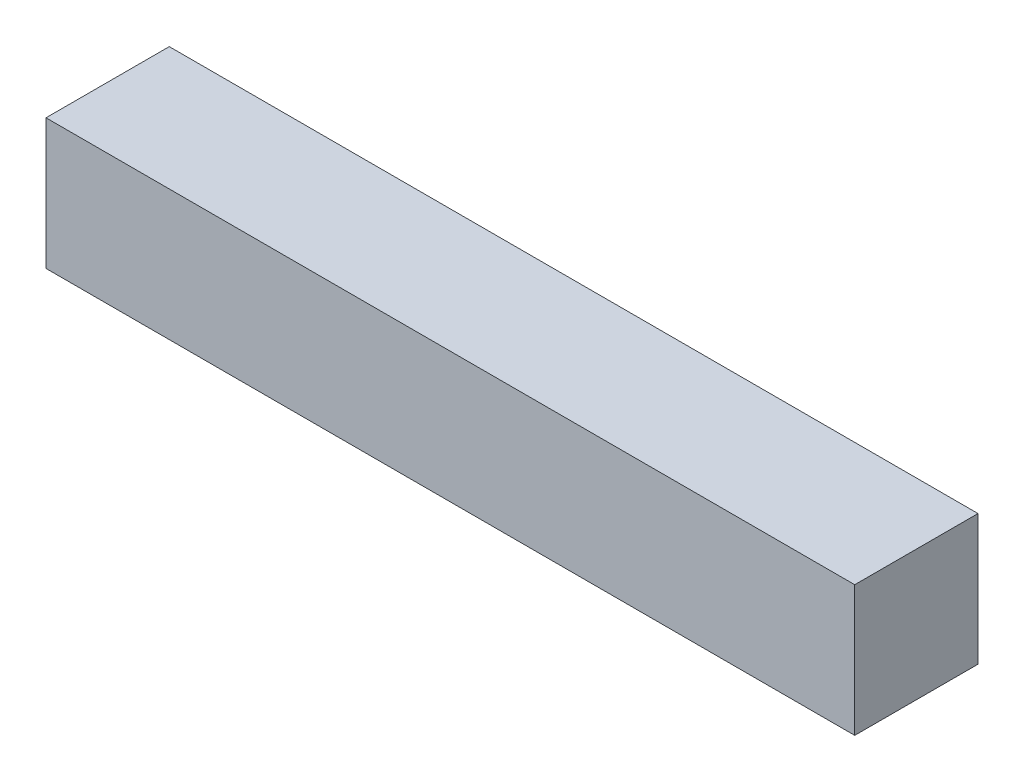
ISO-10303-21;
HEADER;
FILE_DESCRIPTION(('STEP AP214'),'2;1');
FILE_NAME('part.step','',(''),(''),'','','');
FILE_SCHEMA(('AUTOMOTIVE_DESIGN { 1 0 10303 214 1 1 1 1 }'));
ENDSEC;
DATA;
#1=APPLICATION_CONTEXT('core data for automotive mechanical design processes');
#2=APPLICATION_PROTOCOL_DEFINITION('international standard','automotive_design',2000,#1);
#3=PRODUCT_CONTEXT('',#1,'mechanical');
#4=PRODUCT('Part','Part','',(#3));
#5=PRODUCT_RELATED_PRODUCT_CATEGORY('part','',(#4));
#6=PRODUCT_DEFINITION_FORMATION('','',#4);
#7=PRODUCT_DEFINITION_CONTEXT('part definition',#1,'design');
#8=PRODUCT_DEFINITION('design','',#6,#7);
#9=PRODUCT_DEFINITION_SHAPE('','',#8);
#10=(LENGTH_UNIT() NAMED_UNIT(*) SI_UNIT(.MILLI.,.METRE.));
#11=(NAMED_UNIT(*) PLANE_ANGLE_UNIT() SI_UNIT($,.RADIAN.));
#12=(NAMED_UNIT(*) SI_UNIT($,.STERADIAN.) SOLID_ANGLE_UNIT());
#13=UNCERTAINTY_MEASURE_WITH_UNIT(LENGTH_MEASURE(1.E-05),#10,'distance_accuracy_value','');
#14=(GEOMETRIC_REPRESENTATION_CONTEXT(3) GLOBAL_UNCERTAINTY_ASSIGNED_CONTEXT((#13)) GLOBAL_UNIT_ASSIGNED_CONTEXT((#10,
#11,#12)) REPRESENTATION_CONTEXT('',''));
#15=CARTESIAN_POINT('',(0.,0.,0.));
#16=DIRECTION('',(0.,0.,1.));
#17=DIRECTION('',(1.,0.,0.));
#18=AXIS2_PLACEMENT_3D('',#15,#16,#17);
#19=CARTESIAN_POINT('',(500.,40.0630097879282,36.1498785993399));
#20=DIRECTION('',(0.,0.,-1.));
#21=DIRECTION('',(-1.,0.,0.));
#22=AXIS2_PLACEMENT_3D('',#19,#20,#21);
#23=PLANE('',#22);
#24=DIRECTION('',(0.,-1.,0.));
#25=VECTOR('',#24,1.);
#26=CARTESIAN_POINT('',(0.,40.0630097879282,36.1498785993399));
#27=LINE('',#26,#25);
#28=CARTESIAN_POINT('',(0.,40.0630097879282,36.1498785993399));
#29=VERTEX_POINT('',#28);
#30=CARTESIAN_POINT('',(0.,-40.6220285291551,36.1498785993399));
#31=VERTEX_POINT('',#30);
#32=EDGE_CURVE('E113',#29,#31,#27,.T.);
#33=ORIENTED_EDGE('',*,*,#32,.T.);
#34=DIRECTION('',(-1.,0.,0.));
#35=VECTOR('',#34,1.);
#36=CARTESIAN_POINT('',(500.,-40.6220285291551,36.1498785993399));
#37=LINE('',#36,#35);
#38=CARTESIAN_POINT('',(500.,-40.6220285291551,36.1498785993399));
#39=VERTEX_POINT('',#38);
#40=EDGE_CURVE('E11',#39,#31,#37,.T.);
#41=ORIENTED_EDGE('',*,*,#40,.F.);
#42=DIRECTION('',(0.,-1.,0.));
#43=VECTOR('',#42,1.);
#44=CARTESIAN_POINT('',(500.,40.0630097879282,36.1498785993399));
#45=LINE('',#44,#43);
#46=CARTESIAN_POINT('',(500.,40.0630097879282,36.1498785993399));
#47=VERTEX_POINT('',#46);
#48=EDGE_CURVE('E97',#47,#39,#45,.T.);
#49=ORIENTED_EDGE('',*,*,#48,.F.);
#50=DIRECTION('',(-1.,0.,0.));
#51=VECTOR('',#50,1.);
#52=CARTESIAN_POINT('',(500.,40.0630097879282,36.1498785993399));
#53=LINE('',#52,#51);
#54=EDGE_CURVE('E109',#47,#29,#53,.T.);
#55=ORIENTED_EDGE('',*,*,#54,.T.);
#56=EDGE_LOOP('',(#33,#41,#49,#55));
#57=FACE_BOUND('',#56,.T.);
#58=ADVANCED_FACE('F45',(#57),#23,.F.);
#59=CARTESIAN_POINT('',(500.,-40.6220285291551,36.1498785993399));
#60=DIRECTION('',(0.,1.,0.));
#61=DIRECTION('',(0.,0.,1.));
#62=AXIS2_PLACEMENT_3D('',#59,#60,#61);
#63=PLANE('',#62);
#64=DIRECTION('',(0.,0.,-1.));
#65=VECTOR('',#64,1.);
#66=CARTESIAN_POINT('',(0.,-40.6220285291551,36.1498785993399));
#67=LINE('',#66,#65);
#68=CARTESIAN_POINT('',(0.,-40.6220285291551,-40.0630097879282));
#69=VERTEX_POINT('',#68);
#70=EDGE_CURVE('E102',#31,#69,#67,.T.);
#71=ORIENTED_EDGE('',*,*,#70,.T.);
#72=DIRECTION('',(-1.,0.,0.));
#73=VECTOR('',#72,1.);
#74=CARTESIAN_POINT('',(500.,-40.6220285291551,-40.0630097879282));
#75=LINE('',#74,#73);
#76=CARTESIAN_POINT('',(500.,-40.6220285291551,-40.0630097879282));
#77=VERTEX_POINT('',#76);
#78=EDGE_CURVE('E54',#77,#69,#75,.T.);
#79=ORIENTED_EDGE('',*,*,#78,.F.);
#80=DIRECTION('',(0.,0.,-1.));
#81=VECTOR('',#80,1.);
#82=CARTESIAN_POINT('',(500.,-40.6220285291551,36.1498785993399));
#83=LINE('',#82,#81);
#84=EDGE_CURVE('E92',#39,#77,#83,.T.);
#85=ORIENTED_EDGE('',*,*,#84,.F.);
#86=ORIENTED_EDGE('',*,*,#40,.T.);
#87=EDGE_LOOP('',(#71,#79,#85,#86));
#88=FACE_BOUND('',#87,.T.);
#89=ADVANCED_FACE('F101',(#88),#63,.F.);
#90=CARTESIAN_POINT('',(500.,40.0630097879282,-40.0630097879282));
#91=DIRECTION('',(0.,0.,1.));
#92=DIRECTION('',(1.,0.,0.));
#93=AXIS2_PLACEMENT_3D('',#90,#91,#92);
#94=PLANE('',#93);
#95=DIRECTION('',(0.,1.,0.));
#96=VECTOR('',#95,1.);
#97=CARTESIAN_POINT('',(0.,40.0630097879282,-40.0630097879282));
#98=LINE('',#97,#96);
#99=CARTESIAN_POINT('',(0.,40.0630097879282,-40.0630097879282));
#100=VERTEX_POINT('',#99);
#101=EDGE_CURVE('E79',#69,#100,#98,.T.);
#102=ORIENTED_EDGE('',*,*,#101,.T.);
#103=DIRECTION('',(-1.,0.,0.));
#104=VECTOR('',#103,1.);
#105=CARTESIAN_POINT('',(500.,40.0630097879282,-40.0630097879282));
#106=LINE('',#105,#104);
#107=CARTESIAN_POINT('',(500.,40.0630097879282,-40.0630097879282));
#108=VERTEX_POINT('',#107);
#109=EDGE_CURVE('E104',#108,#100,#106,.T.);
#110=ORIENTED_EDGE('',*,*,#109,.F.);
#111=DIRECTION('',(0.,1.,0.));
#112=VECTOR('',#111,1.);
#113=CARTESIAN_POINT('',(500.,40.0630097879282,-40.0630097879282));
#114=LINE('',#113,#112);
#115=EDGE_CURVE('E95',#77,#108,#114,.T.);
#116=ORIENTED_EDGE('',*,*,#115,.F.);
#117=ORIENTED_EDGE('',*,*,#78,.T.);
#118=EDGE_LOOP('',(#102,#110,#116,#117));
#119=FACE_BOUND('',#118,.T.);
#120=ADVANCED_FACE('F105',(#119),#94,.F.);
#121=CARTESIAN_POINT('',(500.,40.0630097879282,36.1498785993399));
#122=DIRECTION('',(0.,-1.,0.));
#123=DIRECTION('',(0.,0.,-1.));
#124=AXIS2_PLACEMENT_3D('',#121,#122,#123);
#125=PLANE('',#124);
#126=DIRECTION('',(0.,0.,1.));
#127=VECTOR('',#126,1.);
#128=CARTESIAN_POINT('',(0.,40.0630097879282,36.1498785993399));
#129=LINE('',#128,#127);
#130=EDGE_CURVE('E85',#100,#29,#129,.T.);
#131=ORIENTED_EDGE('',*,*,#130,.T.);
#132=ORIENTED_EDGE('',*,*,#54,.F.);
#133=DIRECTION('',(0.,0.,1.));
#134=VECTOR('',#133,1.);
#135=CARTESIAN_POINT('',(500.,40.0630097879282,36.1498785993399));
#136=LINE('',#135,#134);
#137=EDGE_CURVE('E62',#108,#47,#136,.T.);
#138=ORIENTED_EDGE('',*,*,#137,.F.);
#139=ORIENTED_EDGE('',*,*,#109,.T.);
#140=EDGE_LOOP('',(#131,#132,#138,#139));
#141=FACE_BOUND('',#140,.T.);
#142=ADVANCED_FACE('F126',(#141),#125,.F.);
#143=CARTESIAN_POINT('',(500.,0.,0.));
#144=DIRECTION('',(1.,0.,0.));
#145=DIRECTION('',(0.,0.,-1.));
#146=AXIS2_PLACEMENT_3D('',#143,#144,#145);
#147=PLANE('',#146);
#148=ORIENTED_EDGE('',*,*,#48,.T.);
#149=ORIENTED_EDGE('',*,*,#84,.T.);
#150=ORIENTED_EDGE('',*,*,#115,.T.);
#151=ORIENTED_EDGE('',*,*,#137,.T.);
#152=EDGE_LOOP('',(#148,#149,#150,#151));
#153=FACE_BOUND('',#152,.T.);
#154=ADVANCED_FACE('F93',(#153),#147,.T.);
#155=CARTESIAN_POINT('',(0.,0.,0.));
#156=DIRECTION('',(1.,0.,0.));
#157=DIRECTION('',(0.,0.,-1.));
#158=AXIS2_PLACEMENT_3D('',#155,#156,#157);
#159=PLANE('',#158);
#160=ORIENTED_EDGE('',*,*,#32,.F.);
#161=ORIENTED_EDGE('',*,*,#130,.F.);
#162=ORIENTED_EDGE('',*,*,#101,.F.);
#163=ORIENTED_EDGE('',*,*,#70,.F.);
#164=EDGE_LOOP('',(#160,#161,#162,#163));
#165=FACE_BOUND('',#164,.T.);
#166=ADVANCED_FACE('F129',(#165),#159,.F.);
#167=CLOSED_SHELL('',(#58,#89,#120,#142,#154,#166));
#168=MANIFOLD_SOLID_BREP('B2',#167);
#169=ADVANCED_BREP_SHAPE_REPRESENTATION('',(#18,#168),#14);
#170=SHAPE_DEFINITION_REPRESENTATION(#9,#169);
ENDSEC;
END-ISO-10303-21;
